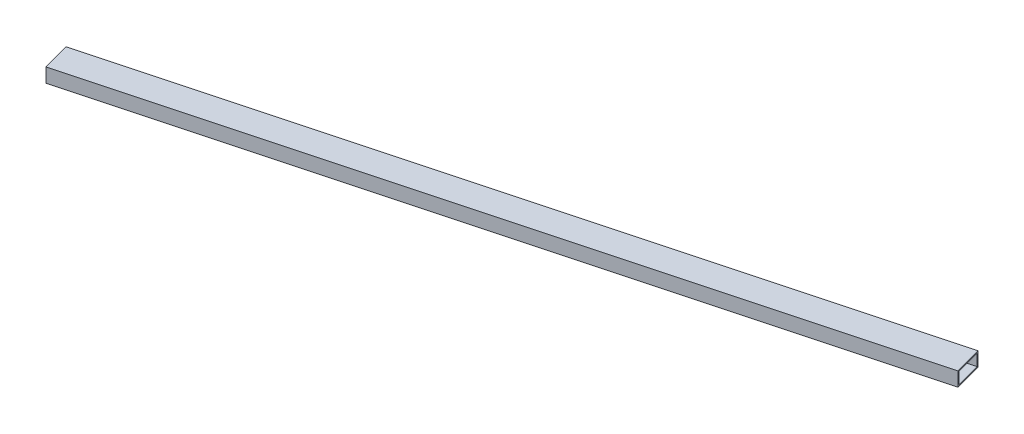
ISO-10303-21;
HEADER;
FILE_DESCRIPTION(('STEP AP214'),'2;1');
FILE_NAME('part.step','',(''),(''),'','','');
FILE_SCHEMA(('AUTOMOTIVE_DESIGN { 1 0 10303 214 1 1 1 1 }'));
ENDSEC;
DATA;
#1=APPLICATION_CONTEXT('core data for automotive mechanical design processes');
#2=APPLICATION_PROTOCOL_DEFINITION('international standard','automotive_design',2000,#1);
#3=PRODUCT_CONTEXT('',#1,'mechanical');
#4=PRODUCT('Part','Part','',(#3));
#5=PRODUCT_RELATED_PRODUCT_CATEGORY('part','',(#4));
#6=PRODUCT_DEFINITION_FORMATION('','',#4);
#7=PRODUCT_DEFINITION_CONTEXT('part definition',#1,'design');
#8=PRODUCT_DEFINITION('design','',#6,#7);
#9=PRODUCT_DEFINITION_SHAPE('','',#8);
#10=(LENGTH_UNIT() NAMED_UNIT(*) SI_UNIT(.MILLI.,.METRE.));
#11=(NAMED_UNIT(*) PLANE_ANGLE_UNIT() SI_UNIT($,.RADIAN.));
#12=(NAMED_UNIT(*) SI_UNIT($,.STERADIAN.) SOLID_ANGLE_UNIT());
#13=UNCERTAINTY_MEASURE_WITH_UNIT(LENGTH_MEASURE(1.E-05),#10,'distance_accuracy_value','');
#14=(GEOMETRIC_REPRESENTATION_CONTEXT(3) GLOBAL_UNCERTAINTY_ASSIGNED_CONTEXT((#13)) GLOBAL_UNIT_ASSIGNED_CONTEXT((#10,
#11,#12)) REPRESENTATION_CONTEXT('',''));
#15=CARTESIAN_POINT('',(0.,0.,0.));
#16=DIRECTION('',(0.,0.,1.));
#17=DIRECTION('',(1.,0.,0.));
#18=AXIS2_PLACEMENT_3D('',#15,#16,#17);
#19=CARTESIAN_POINT('',(1234.484724532,-2000.,2289.266833457));
#20=DIRECTION('',(0.965925826288944,0.,-0.258819045102985));
#21=DIRECTION('',(0.,-1.,0.));
#22=AXIS2_PLACEMENT_3D('',#19,#20,#21);
#23=PLANE('',#22);
#24=DIRECTION('',(-0.258819045102985,0.,-0.965925826288944));
#25=VECTOR('',#24,1.);
#26=CARTESIAN_POINT('',(1246.390400606,-2021.,2333.699421466));
#27=LINE('',#26,#25);
#28=CARTESIAN_POINT('',(1246.390400606,-2021.,2333.699421466));
#29=VERTEX_POINT('',#28);
#30=CARTESIAN_POINT('',(1222.579048457,-2021.,2244.834245448));
#31=VERTEX_POINT('',#30);
#32=EDGE_CURVE('E106',#29,#31,#27,.T.);
#33=ORIENTED_EDGE('',*,*,#32,.F.);
#34=DIRECTION('',(0.,-1.,0.));
#35=VECTOR('',#34,1.);
#36=CARTESIAN_POINT('',(1246.390400606,-1979.,2333.699421466));
#37=LINE('',#36,#35);
#38=CARTESIAN_POINT('',(1246.390400606,-1979.,2333.699421466));
#39=VERTEX_POINT('',#38);
#40=EDGE_CURVE('E163',#39,#29,#37,.T.);
#41=ORIENTED_EDGE('',*,*,#40,.F.);
#42=DIRECTION('',(0.258819045102985,0.,0.965925826288944));
#43=VECTOR('',#42,1.);
#44=CARTESIAN_POINT('',(1222.579048457,-1979.,2244.834245448));
#45=LINE('',#44,#43);
#46=CARTESIAN_POINT('',(1222.579048457,-1979.,2244.834245448));
#47=VERTEX_POINT('',#46);
#48=EDGE_CURVE('E139',#47,#39,#45,.T.);
#49=ORIENTED_EDGE('',*,*,#48,.F.);
#50=DIRECTION('',(0.,1.,0.));
#51=VECTOR('',#50,1.);
#52=CARTESIAN_POINT('',(1222.579048457,-2021.,2244.834245448));
#53=LINE('',#52,#51);
#54=EDGE_CURVE('E21',#31,#47,#53,.T.);
#55=ORIENTED_EDGE('',*,*,#54,.F.);
#56=EDGE_LOOP('',(#33,#41,#49,#55));
#57=FACE_BOUND('',#56,.T.);
#58=DIRECTION('',(0.,1.,0.));
#59=VECTOR('',#58,1.);
#60=CARTESIAN_POINT('',(1221.543772277,-2025.,2240.970542143));
#61=LINE('',#60,#59);
#62=CARTESIAN_POINT('',(1221.543772277,-2025.,2240.970542143));
#63=VERTEX_POINT('',#62);
#64=CARTESIAN_POINT('',(1221.543772277,-1975.,2240.970542143));
#65=VERTEX_POINT('',#64);
#66=EDGE_CURVE('E119',#63,#65,#61,.T.);
#67=ORIENTED_EDGE('',*,*,#66,.T.);
#68=DIRECTION('',(0.258819045102985,0.,0.965925826288944));
#69=VECTOR('',#68,1.);
#70=CARTESIAN_POINT('',(1221.543772277,-1975.,2240.970542143));
#71=LINE('',#70,#69);
#72=CARTESIAN_POINT('',(1247.425676787,-1975.,2337.563124771));
#73=VERTEX_POINT('',#72);
#74=EDGE_CURVE('E146',#65,#73,#71,.T.);
#75=ORIENTED_EDGE('',*,*,#74,.T.);
#76=DIRECTION('',(0.,-1.,0.));
#77=VECTOR('',#76,1.);
#78=CARTESIAN_POINT('',(1247.425676787,-1975.,2337.563124771));
#79=LINE('',#78,#77);
#80=CARTESIAN_POINT('',(1247.425676787,-2025.,2337.563124771));
#81=VERTEX_POINT('',#80);
#82=EDGE_CURVE('E127',#73,#81,#79,.T.);
#83=ORIENTED_EDGE('',*,*,#82,.T.);
#84=DIRECTION('',(-0.258819045102985,0.,-0.965925826288944));
#85=VECTOR('',#84,1.);
#86=CARTESIAN_POINT('',(1247.425676787,-2025.,2337.563124771));
#87=LINE('',#86,#85);
#88=EDGE_CURVE('E143',#81,#63,#87,.T.);
#89=ORIENTED_EDGE('',*,*,#88,.T.);
#90=EDGE_LOOP('',(#67,#75,#83,#89));
#91=FACE_BOUND('',#90,.T.);
#92=ADVANCED_FACE('F17',(#57,#91),#23,.T.);
#93=CARTESIAN_POINT('',(-1302.036495303,-2000.,2968.925645896));
#94=DIRECTION('',(0.965925826288944,0.,-0.258819045102985));
#95=DIRECTION('',(0.,-1.,0.));
#96=AXIS2_PLACEMENT_3D('',#93,#94,#95);
#97=PLANE('',#96);
#98=DIRECTION('',(0.,1.,0.));
#99=VECTOR('',#98,1.);
#100=CARTESIAN_POINT('',(-1313.942171378,-2021.,2924.493057887));
#101=LINE('',#100,#99);
#102=CARTESIAN_POINT('',(-1313.942171378,-2021.,2924.493057887));
#103=VERTEX_POINT('',#102);
#104=CARTESIAN_POINT('',(-1313.942171378,-1979.,2924.493057887));
#105=VERTEX_POINT('',#104);
#106=EDGE_CURVE('E11',#103,#105,#101,.T.);
#107=ORIENTED_EDGE('',*,*,#106,.T.);
#108=DIRECTION('',(0.258819045102985,0.,0.965925826288944));
#109=VECTOR('',#108,1.);
#110=CARTESIAN_POINT('',(-1313.942171378,-1979.,2924.493057887));
#111=LINE('',#110,#109);
#112=CARTESIAN_POINT('',(-1290.130819229,-1979.,3013.358233905));
#113=VERTEX_POINT('',#112);
#114=EDGE_CURVE('E170',#105,#113,#111,.T.);
#115=ORIENTED_EDGE('',*,*,#114,.T.);
#116=DIRECTION('',(0.,-1.,0.));
#117=VECTOR('',#116,1.);
#118=CARTESIAN_POINT('',(-1290.130819229,-1979.,3013.358233905));
#119=LINE('',#118,#117);
#120=CARTESIAN_POINT('',(-1290.130819229,-2021.,3013.358233905));
#121=VERTEX_POINT('',#120);
#122=EDGE_CURVE('E97',#113,#121,#119,.T.);
#123=ORIENTED_EDGE('',*,*,#122,.T.);
#124=DIRECTION('',(-0.258819045102985,0.,-0.965925826288944));
#125=VECTOR('',#124,1.);
#126=CARTESIAN_POINT('',(-1290.130819229,-2021.,3013.358233905));
#127=LINE('',#126,#125);
#128=EDGE_CURVE('E94',#121,#103,#127,.T.);
#129=ORIENTED_EDGE('',*,*,#128,.T.);
#130=EDGE_LOOP('',(#107,#115,#123,#129));
#131=FACE_BOUND('',#130,.T.);
#132=DIRECTION('',(-0.258819045102985,0.,-0.965925826288944));
#133=VECTOR('',#132,1.);
#134=CARTESIAN_POINT('',(-1289.095543048,-2025.,3017.221937211));
#135=LINE('',#134,#133);
#136=CARTESIAN_POINT('',(-1289.095543048,-2025.,3017.221937211));
#137=VERTEX_POINT('',#136);
#138=CARTESIAN_POINT('',(-1314.977447559,-2025.,2920.629354582));
#139=VERTEX_POINT('',#138);
#140=EDGE_CURVE('E131',#137,#139,#135,.T.);
#141=ORIENTED_EDGE('',*,*,#140,.F.);
#142=DIRECTION('',(0.,-1.,0.));
#143=VECTOR('',#142,1.);
#144=CARTESIAN_POINT('',(-1289.095543048,-1975.,3017.221937211));
#145=LINE('',#144,#143);
#146=CARTESIAN_POINT('',(-1289.095543048,-1975.,3017.221937211));
#147=VERTEX_POINT('',#146);
#148=EDGE_CURVE('E152',#147,#137,#145,.T.);
#149=ORIENTED_EDGE('',*,*,#148,.F.);
#150=DIRECTION('',(0.258819045102985,0.,0.965925826288944));
#151=VECTOR('',#150,1.);
#152=CARTESIAN_POINT('',(-1314.977447559,-1975.,2920.629354582));
#153=LINE('',#152,#151);
#154=CARTESIAN_POINT('',(-1314.977447559,-1975.,2920.629354582));
#155=VERTEX_POINT('',#154);
#156=EDGE_CURVE('E126',#155,#147,#153,.T.);
#157=ORIENTED_EDGE('',*,*,#156,.F.);
#158=DIRECTION('',(0.,1.,0.));
#159=VECTOR('',#158,1.);
#160=CARTESIAN_POINT('',(-1314.977447559,-2025.,2920.629354582));
#161=LINE('',#160,#159);
#162=EDGE_CURVE('E270',#139,#155,#161,.T.);
#163=ORIENTED_EDGE('',*,*,#162,.F.);
#164=EDGE_LOOP('',(#141,#149,#157,#163));
#165=FACE_BOUND('',#164,.T.);
#166=ADVANCED_FACE('F19',(#131,#165),#97,.F.);
#167=CARTESIAN_POINT('',(-1313.942171378,-2021.,2924.493057887));
#168=DIRECTION('',(0.258819045102985,0.,0.965925826288944));
#169=DIRECTION('',(0.,-1.,0.));
#170=AXIS2_PLACEMENT_3D('',#167,#168,#169);
#171=PLANE('',#170);
#172=DIRECTION('',(0.965925826288944,0.,-0.258819045102985));
#173=VECTOR('',#172,1.);
#174=CARTESIAN_POINT('',(-1313.942171378,-2021.,2924.493057887));
#175=LINE('',#174,#173);
#176=EDGE_CURVE('E86',#103,#31,#175,.T.);
#177=ORIENTED_EDGE('',*,*,#176,.T.);
#178=ORIENTED_EDGE('',*,*,#54,.T.);
#179=DIRECTION('',(0.965925826288944,0.,-0.258819045102985));
#180=VECTOR('',#179,1.);
#181=CARTESIAN_POINT('',(-1313.942171378,-1979.,2924.493057887));
#182=LINE('',#181,#180);
#183=EDGE_CURVE('E89',#105,#47,#182,.T.);
#184=ORIENTED_EDGE('',*,*,#183,.F.);
#185=ORIENTED_EDGE('',*,*,#106,.F.);
#186=EDGE_LOOP('',(#177,#178,#184,#185));
#187=FACE_BOUND('',#186,.T.);
#188=ADVANCED_FACE('F84',(#187),#171,.T.);
#189=CARTESIAN_POINT('',(-1313.942171378,-1979.,2924.493057887));
#190=DIRECTION('',(0.,-1.,0.));
#191=DIRECTION('',(0.,0.,-1.));
#192=AXIS2_PLACEMENT_3D('',#189,#190,#191);
#193=PLANE('',#192);
#194=ORIENTED_EDGE('',*,*,#183,.T.);
#195=ORIENTED_EDGE('',*,*,#48,.T.);
#196=DIRECTION('',(0.965925826288944,0.,-0.258819045102985));
#197=VECTOR('',#196,1.);
#198=CARTESIAN_POINT('',(-1290.130819229,-1979.,3013.358233905));
#199=LINE('',#198,#197);
#200=EDGE_CURVE('E102',#113,#39,#199,.T.);
#201=ORIENTED_EDGE('',*,*,#200,.F.);
#202=ORIENTED_EDGE('',*,*,#114,.F.);
#203=EDGE_LOOP('',(#194,#195,#201,#202));
#204=FACE_BOUND('',#203,.T.);
#205=ADVANCED_FACE('F209',(#204),#193,.T.);
#206=CARTESIAN_POINT('',(-1290.130819229,-1979.,3013.358233905));
#207=DIRECTION('',(-0.258819045102985,0.,-0.965925826288944));
#208=DIRECTION('',(-0.965925826288944,0.,0.258819045102985));
#209=AXIS2_PLACEMENT_3D('',#206,#207,#208);
#210=PLANE('',#209);
#211=ORIENTED_EDGE('',*,*,#200,.T.);
#212=ORIENTED_EDGE('',*,*,#40,.T.);
#213=DIRECTION('',(0.965925826288944,0.,-0.258819045102985));
#214=VECTOR('',#213,1.);
#215=CARTESIAN_POINT('',(-1290.130819229,-2021.,3013.358233905));
#216=LINE('',#215,#214);
#217=EDGE_CURVE('E113',#121,#29,#216,.T.);
#218=ORIENTED_EDGE('',*,*,#217,.F.);
#219=ORIENTED_EDGE('',*,*,#122,.F.);
#220=EDGE_LOOP('',(#211,#212,#218,#219));
#221=FACE_BOUND('',#220,.T.);
#222=ADVANCED_FACE('F224',(#221),#210,.T.);
#223=CARTESIAN_POINT('',(-1290.130819229,-2021.,3013.358233905));
#224=DIRECTION('',(0.,1.,0.));
#225=DIRECTION('',(1.,0.,0.));
#226=AXIS2_PLACEMENT_3D('',#223,#224,#225);
#227=PLANE('',#226);
#228=ORIENTED_EDGE('',*,*,#217,.T.);
#229=ORIENTED_EDGE('',*,*,#32,.T.);
#230=ORIENTED_EDGE('',*,*,#176,.F.);
#231=ORIENTED_EDGE('',*,*,#128,.F.);
#232=EDGE_LOOP('',(#228,#229,#230,#231));
#233=FACE_BOUND('',#232,.T.);
#234=ADVANCED_FACE('F104',(#233),#227,.T.);
#235=CARTESIAN_POINT('',(-1289.095543048,-2025.,3017.221937211));
#236=DIRECTION('',(0.,1.,0.));
#237=DIRECTION('',(1.,0.,0.));
#238=AXIS2_PLACEMENT_3D('',#235,#236,#237);
#239=PLANE('',#238);
#240=ORIENTED_EDGE('',*,*,#140,.T.);
#241=DIRECTION('',(0.965925826288944,0.,-0.258819045102985));
#242=VECTOR('',#241,1.);
#243=CARTESIAN_POINT('',(-1314.977447559,-2025.,2920.629354582));
#244=LINE('',#243,#242);
#245=EDGE_CURVE('E122',#139,#63,#244,.T.);
#246=ORIENTED_EDGE('',*,*,#245,.T.);
#247=ORIENTED_EDGE('',*,*,#88,.F.);
#248=DIRECTION('',(0.965925826288944,0.,-0.258819045102985));
#249=VECTOR('',#248,1.);
#250=CARTESIAN_POINT('',(-1289.095543048,-2025.,3017.221937211));
#251=LINE('',#250,#249);
#252=EDGE_CURVE('E132',#137,#81,#251,.T.);
#253=ORIENTED_EDGE('',*,*,#252,.F.);
#254=EDGE_LOOP('',(#240,#246,#247,#253));
#255=FACE_BOUND('',#254,.T.);
#256=ADVANCED_FACE('F200',(#255),#239,.F.);
#257=CARTESIAN_POINT('',(-1289.095543048,-1975.,3017.221937211));
#258=DIRECTION('',(-0.258819045102985,0.,-0.965925826288944));
#259=DIRECTION('',(-0.965925826288944,0.,0.258819045102985));
#260=AXIS2_PLACEMENT_3D('',#257,#258,#259);
#261=PLANE('',#260);
#262=ORIENTED_EDGE('',*,*,#148,.T.);
#263=ORIENTED_EDGE('',*,*,#252,.T.);
#264=ORIENTED_EDGE('',*,*,#82,.F.);
#265=DIRECTION('',(0.965925826288944,0.,-0.258819045102985));
#266=VECTOR('',#265,1.);
#267=CARTESIAN_POINT('',(-1289.095543048,-1975.,3017.221937211));
#268=LINE('',#267,#266);
#269=EDGE_CURVE('E136',#147,#73,#268,.T.);
#270=ORIENTED_EDGE('',*,*,#269,.F.);
#271=EDGE_LOOP('',(#262,#263,#264,#270));
#272=FACE_BOUND('',#271,.T.);
#273=ADVANCED_FACE('F192',(#272),#261,.F.);
#274=CARTESIAN_POINT('',(-1314.977447559,-1975.,2920.629354582));
#275=DIRECTION('',(0.,-1.,0.));
#276=DIRECTION('',(0.,0.,-1.));
#277=AXIS2_PLACEMENT_3D('',#274,#275,#276);
#278=PLANE('',#277);
#279=ORIENTED_EDGE('',*,*,#156,.T.);
#280=ORIENTED_EDGE('',*,*,#269,.T.);
#281=ORIENTED_EDGE('',*,*,#74,.F.);
#282=DIRECTION('',(0.965925826288944,0.,-0.258819045102985));
#283=VECTOR('',#282,1.);
#284=CARTESIAN_POINT('',(-1314.977447559,-1975.,2920.629354582));
#285=LINE('',#284,#283);
#286=EDGE_CURVE('E117',#155,#65,#285,.T.);
#287=ORIENTED_EDGE('',*,*,#286,.F.);
#288=EDGE_LOOP('',(#279,#280,#281,#287));
#289=FACE_BOUND('',#288,.T.);
#290=ADVANCED_FACE('F183',(#289),#278,.F.);
#291=CARTESIAN_POINT('',(-1314.977447559,-2025.,2920.629354582));
#292=DIRECTION('',(0.258819045102985,0.,0.965925826288944));
#293=DIRECTION('',(0.,-1.,0.));
#294=AXIS2_PLACEMENT_3D('',#291,#292,#293);
#295=PLANE('',#294);
#296=ORIENTED_EDGE('',*,*,#162,.T.);
#297=ORIENTED_EDGE('',*,*,#286,.T.);
#298=ORIENTED_EDGE('',*,*,#66,.F.);
#299=ORIENTED_EDGE('',*,*,#245,.F.);
#300=EDGE_LOOP('',(#296,#297,#298,#299));
#301=FACE_BOUND('',#300,.T.);
#302=ADVANCED_FACE('F178',(#301),#295,.F.);
#303=CLOSED_SHELL('',(#92,#166,#188,#205,#222,#234,#256,#273,#290,#302));
#304=MANIFOLD_SOLID_BREP('B1',#303);
#305=ADVANCED_BREP_SHAPE_REPRESENTATION('',(#18,#304),#14);
#306=SHAPE_DEFINITION_REPRESENTATION(#9,#305);
ENDSEC;
END-ISO-10303-21;
